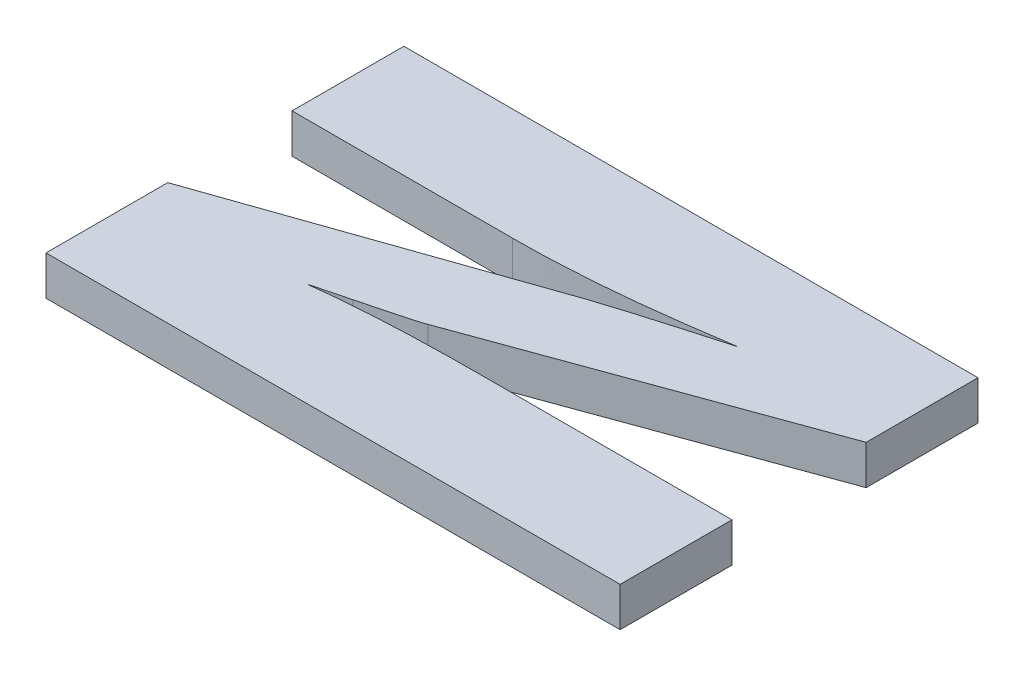
ISO-10303-21;
HEADER;
FILE_DESCRIPTION(('STEP AP214'),'2;1');
FILE_NAME('part.step','',(''),(''),'','','');
FILE_SCHEMA(('AUTOMOTIVE_DESIGN { 1 0 10303 214 1 1 1 1 }'));
ENDSEC;
DATA;
#1=APPLICATION_CONTEXT('core data for automotive mechanical design processes');
#2=APPLICATION_PROTOCOL_DEFINITION('international standard','automotive_design',2000,#1);
#3=PRODUCT_CONTEXT('',#1,'mechanical');
#4=PRODUCT('Part','Part','',(#3));
#5=PRODUCT_RELATED_PRODUCT_CATEGORY('part','',(#4));
#6=PRODUCT_DEFINITION_FORMATION('','',#4);
#7=PRODUCT_DEFINITION_CONTEXT('part definition',#1,'design');
#8=PRODUCT_DEFINITION('design','',#6,#7);
#9=PRODUCT_DEFINITION_SHAPE('','',#8);
#10=(LENGTH_UNIT() NAMED_UNIT(*) SI_UNIT(.MILLI.,.METRE.));
#11=(NAMED_UNIT(*) PLANE_ANGLE_UNIT() SI_UNIT($,.RADIAN.));
#12=(NAMED_UNIT(*) SI_UNIT($,.STERADIAN.) SOLID_ANGLE_UNIT());
#13=UNCERTAINTY_MEASURE_WITH_UNIT(LENGTH_MEASURE(1.E-05),#10,'distance_accuracy_value','');
#14=(GEOMETRIC_REPRESENTATION_CONTEXT(3) GLOBAL_UNCERTAINTY_ASSIGNED_CONTEXT((#13)) GLOBAL_UNIT_ASSIGNED_CONTEXT((#10,
#11,#12)) REPRESENTATION_CONTEXT('',''));
#15=CARTESIAN_POINT('',(0.,0.,0.));
#16=DIRECTION('',(0.,0.,1.));
#17=DIRECTION('',(1.,0.,0.));
#18=AXIS2_PLACEMENT_3D('',#15,#16,#17);
#19=CARTESIAN_POINT('',(2.55,2.9956,4.5909090909091));
#20=DIRECTION('',(1.,0.,0.));
#21=DIRECTION('',(0.,-1.,0.));
#22=AXIS2_PLACEMENT_3D('',#19,#20,#21);
#23=PLANE('',#22);
#24=DIRECTION('',(0.,0.,1.));
#25=VECTOR('',#24,1.);
#26=CARTESIAN_POINT('',(2.55,2.9306,4.5909090909091));
#27=LINE('',#26,#25);
#28=CARTESIAN_POINT('',(2.55,2.9306,4.5909090909091));
#29=VERTEX_POINT('',#28);
#30=CARTESIAN_POINT('',(2.55,2.9306,4.775974025974));
#31=VERTEX_POINT('',#30);
#32=EDGE_CURVE('E11',#29,#31,#27,.T.);
#33=ORIENTED_EDGE('',*,*,#32,.F.);
#34=DIRECTION('',(0.,-1.,0.));
#35=VECTOR('',#34,1.);
#36=CARTESIAN_POINT('',(2.55,2.9956,4.5909090909091));
#37=LINE('',#36,#35);
#38=CARTESIAN_POINT('',(2.55,2.9956,4.5909090909091));
#39=VERTEX_POINT('',#38);
#40=EDGE_CURVE('E24',#39,#29,#37,.T.);
#41=ORIENTED_EDGE('',*,*,#40,.F.);
#42=DIRECTION('',(0.,0.,1.));
#43=VECTOR('',#42,1.);
#44=CARTESIAN_POINT('',(2.55,2.9956,4.5909090909091));
#45=LINE('',#44,#43);
#46=CARTESIAN_POINT('',(2.55,2.9956,4.775974025974));
#47=VERTEX_POINT('',#46);
#48=EDGE_CURVE('E304',#39,#47,#45,.T.);
#49=ORIENTED_EDGE('',*,*,#48,.T.);
#50=DIRECTION('',(0.,-1.,0.));
#51=VECTOR('',#50,1.);
#52=CARTESIAN_POINT('',(2.55,2.9956,4.775974025974));
#53=LINE('',#52,#51);
#54=EDGE_CURVE('E144',#47,#31,#53,.T.);
#55=ORIENTED_EDGE('',*,*,#54,.T.);
#56=EDGE_LOOP('',(#33,#41,#49,#55));
#57=FACE_BOUND('',#56,.T.);
#58=ADVANCED_FACE('F17',(#57),#23,.T.);
#59=CARTESIAN_POINT('',(2.1505681818182,2.9956,4.5909090909091));
#60=DIRECTION('',(0.,0.,-1.));
#61=DIRECTION('',(0.,1.,0.));
#62=AXIS2_PLACEMENT_3D('',#59,#60,#61);
#63=PLANE('',#62);
#64=DIRECTION('',(1.,0.,0.));
#65=VECTOR('',#64,1.);
#66=CARTESIAN_POINT('',(2.1505681818182,2.9306,4.5909090909091));
#67=LINE('',#66,#65);
#68=CARTESIAN_POINT('',(2.1505681818182,2.9306,4.5909090909091));
#69=VERTEX_POINT('',#68);
#70=EDGE_CURVE('E301',#69,#29,#67,.T.);
#71=ORIENTED_EDGE('',*,*,#70,.F.);
#72=DIRECTION('',(0.,-1.,0.));
#73=VECTOR('',#72,1.);
#74=CARTESIAN_POINT('',(2.1505681818182,2.9956,4.5909090909091));
#75=LINE('',#74,#73);
#76=CARTESIAN_POINT('',(2.1505681818182,2.9956,4.5909090909091));
#77=VERTEX_POINT('',#76);
#78=EDGE_CURVE('E298',#77,#69,#75,.T.);
#79=ORIENTED_EDGE('',*,*,#78,.F.);
#80=DIRECTION('',(1.,0.,0.));
#81=VECTOR('',#80,1.);
#82=CARTESIAN_POINT('',(2.1505681818182,2.9956,4.5909090909091));
#83=LINE('',#82,#81);
#84=EDGE_CURVE('E292',#77,#39,#83,.T.);
#85=ORIENTED_EDGE('',*,*,#84,.T.);
#86=ORIENTED_EDGE('',*,*,#40,.T.);
#87=EDGE_LOOP('',(#71,#79,#85,#86));
#88=FACE_BOUND('',#87,.T.);
#89=ADVANCED_FACE('F306',(#88),#63,.T.);
#90=CARTESIAN_POINT('',(1.8602475649351,2.9956,4.604788961039));
#91=CARTESIAN_POINT('',(1.8602475649351,2.9306,4.604788961039));
#92=CARTESIAN_POINT('',(1.8697539808169,2.9956,4.6036621336621));
#93=CARTESIAN_POINT('',(1.8697539808169,2.9306,4.6036621336621));
#94=CARTESIAN_POINT('',(1.8893246513752,2.9956,4.6013423564039));
#95=CARTESIAN_POINT('',(1.8893246513752,2.9306,4.6013423564039));
#96=CARTESIAN_POINT('',(1.9195917324686,2.9956,4.5984390117173));
#97=CARTESIAN_POINT('',(1.9195917324686,2.9306,4.5984390117173));
#98=CARTESIAN_POINT('',(1.9516087312064,2.9956,4.596204791172));
#99=CARTESIAN_POINT('',(1.9516087312064,2.9306,4.596204791172));
#100=CARTESIAN_POINT('',(1.9856671068956,2.9956,4.5942387039112));
#101=CARTESIAN_POINT('',(1.9856671068956,2.9306,4.5942387039112));
#102=CARTESIAN_POINT('',(2.0222994249118,2.9956,4.5927276615182));
#103=CARTESIAN_POINT('',(2.0222994249118,2.9306,4.5927276615182));
#104=CARTESIAN_POINT('',(2.0620767162216,2.9956,4.5915279327125));
#105=CARTESIAN_POINT('',(2.0620767162216,2.9306,4.5915279327125));
#106=CARTESIAN_POINT('',(2.1052002503024,2.9956,4.5910264861099));
#107=CARTESIAN_POINT('',(2.1052002503024,2.9306,4.5910264861099));
#108=CARTESIAN_POINT('',(2.1350817933421,2.9956,4.5909491638775));
#109=CARTESIAN_POINT('',(2.1350817933421,2.9306,4.5909491638775));
#110=CARTESIAN_POINT('',(2.1505681818182,2.9956,4.5909090909091));
#111=CARTESIAN_POINT('',(2.1505681818182,2.9306,4.5909090909091));
#112=B_SPLINE_SURFACE_WITH_KNOTS('',3,1,((#90,#91),(#92,#93),(#94,#95),(#96,#97),(#98,#99),
(#100,#101),(#102,#103),(#104,#105),(#106,#107),(#108,#109),(#110,#111)),.UNSPECIFIED.,.F.,.F.,
.F.,(4,1,1,1,1,1,1,1,4),(2,2),(0.,0.0987436761301101,0.203281655177407,0.313598331697713,
0.429782574178868,0.555169367497819,0.691769978254937,0.840256915434746,1.),(0.,1.),.UNSPECIFIED.);
#113=CARTESIAN_POINT('',(1.8602475649351,2.9306,4.604788961039));
#114=CARTESIAN_POINT('',(1.8697539808169,2.9306,4.6036621336621));
#115=CARTESIAN_POINT('',(1.8893246513752,2.9306,4.6013423564039));
#116=CARTESIAN_POINT('',(1.9195917324686,2.9306,4.5984390117173));
#117=CARTESIAN_POINT('',(1.9516087312064,2.9306,4.596204791172));
#118=CARTESIAN_POINT('',(1.9856671068956,2.9306,4.5942387039112));
#119=CARTESIAN_POINT('',(2.0222994249118,2.9306,4.5927276615182));
#120=CARTESIAN_POINT('',(2.0620767162216,2.9306,4.5915279327125));
#121=CARTESIAN_POINT('',(2.1052002503024,2.9306,4.5910264861099));
#122=CARTESIAN_POINT('',(2.1350817933421,2.9306,4.5909491638775));
#123=CARTESIAN_POINT('',(2.1505681818182,2.9306,4.5909090909091));
#124=B_SPLINE_CURVE_WITH_KNOTS('',3,(#113,#114,#115,#116,#117,#118,#119,#120,#121,#122,#123),
.UNSPECIFIED.,.F.,.F.,(4,1,1,1,1,1,1,1,4),(0.,0.0987436761301101,0.203281655177407,
0.313598331697713,0.429782574178868,0.555169367497819,0.691769978254937,0.840256915434746,1.),.UNSPECIFIED.);
#125=CARTESIAN_POINT('',(1.8602475649351,2.9306,4.604788961039));
#126=VERTEX_POINT('',#125);
#127=EDGE_CURVE('E287',#126,#69,#124,.T.);
#128=DIRECTION('',(0.,-1.,0.));
#129=VECTOR('',#128,1.);
#130=CARTESIAN_POINT('',(1.8602475649351,2.9956,4.604788961039));
#131=LINE('',#130,#129);
#132=CARTESIAN_POINT('',(1.8602475649351,2.9956,4.604788961039));
#133=VERTEX_POINT('',#132);
#134=EDGE_CURVE('E281',#133,#126,#131,.T.);
#135=CARTESIAN_POINT('',(1.8602475649351,2.9956,4.604788961039));
#136=CARTESIAN_POINT('',(1.8697539808169,2.9956,4.6036621336621));
#137=CARTESIAN_POINT('',(1.8893246513752,2.9956,4.6013423564039));
#138=CARTESIAN_POINT('',(1.9195917324686,2.9956,4.5984390117173));
#139=CARTESIAN_POINT('',(1.9516087312064,2.9956,4.596204791172));
#140=CARTESIAN_POINT('',(1.9856671068956,2.9956,4.5942387039112));
#141=CARTESIAN_POINT('',(2.0222994249118,2.9956,4.5927276615182));
#142=CARTESIAN_POINT('',(2.0620767162216,2.9956,4.5915279327125));
#143=CARTESIAN_POINT('',(2.1052002503024,2.9956,4.5910264861099));
#144=CARTESIAN_POINT('',(2.1350817933421,2.9956,4.5909491638775));
#145=CARTESIAN_POINT('',(2.1505681818182,2.9956,4.5909090909091));
#146=B_SPLINE_CURVE_WITH_KNOTS('',3,(#135,#136,#137,#138,#139,#140,#141,#142,#143,#144,#145),
.UNSPECIFIED.,.F.,.F.,(4,1,1,1,1,1,1,1,4),(0.,0.0987436761301101,0.203281655177407,
0.313598331697713,0.429782574178868,0.555169367497819,0.691769978254937,0.840256915434746,1.),.UNSPECIFIED.);
#147=EDGE_CURVE('E273',#133,#77,#146,.T.);
#148=ORIENTED_EDGE('',*,*,#127,.F.);
#149=ORIENTED_EDGE('',*,*,#134,.F.);
#150=ORIENTED_EDGE('',*,*,#147,.T.);
#151=ORIENTED_EDGE('',*,*,#78,.T.);
#152=EDGE_LOOP('',(#148,#149,#150,#151));
#153=FACE_BOUND('',#152,.T.);
#154=ADVANCED_FACE('F310',(#153),#112,.T.);
#155=CARTESIAN_POINT('',(1.9213575487013,2.9956,4.5889813311688));
#156=CARTESIAN_POINT('',(1.9213575487013,2.9306,4.5889813311688));
#157=CARTESIAN_POINT('',(1.9151961299531,2.9956,4.5906166048887));
#158=CARTESIAN_POINT('',(1.9151961299531,2.9306,4.5906166048887));
#159=CARTESIAN_POINT('',(1.9036569084999,2.9956,4.5936791764101));
#160=CARTESIAN_POINT('',(1.9036569084999,2.9306,4.5936791764101));
#161=CARTESIAN_POINT('',(1.8872464681369,2.9956,4.5975771675348));
#162=CARTESIAN_POINT('',(1.8872464681369,2.9306,4.5975771675348));
#163=CARTESIAN_POINT('',(1.8731353541589,2.9956,4.6015852430675));
#164=CARTESIAN_POINT('',(1.8731353541589,2.9306,4.6015852430675));
#165=CARTESIAN_POINT('',(1.8643012099442,2.9956,4.6037812835281));
#166=CARTESIAN_POINT('',(1.8643012099442,2.9306,4.6037812835281));
#167=CARTESIAN_POINT('',(1.8602475649351,2.9956,4.604788961039));
#168=CARTESIAN_POINT('',(1.8602475649351,2.9306,4.604788961039));
#169=B_SPLINE_SURFACE_WITH_KNOTS('',3,1,((#155,#156),(#157,#158),(#159,#160),(#161,#162),(#163,
#164),(#165,#166),(#167,#168)),.UNSPECIFIED.,.F.,.F.,.F.,(4,1,1,1,4),(2,2),(0.,
0.302959861360813,0.567388952857916,0.801491625049401,1.),(0.,1.),.UNSPECIFIED.);
#170=CARTESIAN_POINT('',(1.9213575487013,2.9306,4.5889813311688));
#171=CARTESIAN_POINT('',(1.9151961299531,2.9306,4.5906166048887));
#172=CARTESIAN_POINT('',(1.9036569084999,2.9306,4.5936791764101));
#173=CARTESIAN_POINT('',(1.8872464681369,2.9306,4.5975771675348));
#174=CARTESIAN_POINT('',(1.8731353541589,2.9306,4.6015852430675));
#175=CARTESIAN_POINT('',(1.8643012099442,2.9306,4.6037812835281));
#176=CARTESIAN_POINT('',(1.8602475649351,2.9306,4.604788961039));
#177=B_SPLINE_CURVE_WITH_KNOTS('',3,(#170,#171,#172,#173,#174,#175,#176),.UNSPECIFIED.,.F.,.F.,
(4,1,1,1,4),(0.,0.302959861360813,0.567388952857916,0.801491625049401,1.),.UNSPECIFIED.);
#178=CARTESIAN_POINT('',(1.9213575487013,2.9306,4.5889813311688));
#179=VERTEX_POINT('',#178);
#180=EDGE_CURVE('E268',#179,#126,#177,.T.);
#181=DIRECTION('',(0.,-1.,0.));
#182=VECTOR('',#181,1.);
#183=CARTESIAN_POINT('',(1.9213575487013,2.9956,4.5889813311688));
#184=LINE('',#183,#182);
#185=CARTESIAN_POINT('',(1.9213575487013,2.9956,4.5889813311688));
#186=VERTEX_POINT('',#185);
#187=EDGE_CURVE('E262',#186,#179,#184,.T.);
#188=CARTESIAN_POINT('',(1.9213575487013,2.9956,4.5889813311688));
#189=CARTESIAN_POINT('',(1.9151961299531,2.9956,4.5906166048887));
#190=CARTESIAN_POINT('',(1.9036569084999,2.9956,4.5936791764101));
#191=CARTESIAN_POINT('',(1.8872464681369,2.9956,4.5975771675348));
#192=CARTESIAN_POINT('',(1.8731353541589,2.9956,4.6015852430675));
#193=CARTESIAN_POINT('',(1.8643012099442,2.9956,4.6037812835281));
#194=CARTESIAN_POINT('',(1.8602475649351,2.9956,4.604788961039));
#195=B_SPLINE_CURVE_WITH_KNOTS('',3,(#188,#189,#190,#191,#192,#193,#194),.UNSPECIFIED.,.F.,.F.,
(4,1,1,1,4),(0.,0.302959861360813,0.567388952857916,0.801491625049401,1.),.UNSPECIFIED.);
#196=EDGE_CURVE('E254',#186,#133,#195,.T.);
#197=ORIENTED_EDGE('',*,*,#180,.F.);
#198=ORIENTED_EDGE('',*,*,#187,.F.);
#199=ORIENTED_EDGE('',*,*,#196,.T.);
#200=ORIENTED_EDGE('',*,*,#134,.T.);
#201=EDGE_LOOP('',(#197,#198,#199,#200));
#202=FACE_BOUND('',#201,.T.);
#203=ADVANCED_FACE('F313',(#202),#169,.T.);
#204=CARTESIAN_POINT('',(2.0183238636364,2.9956,4.5623782467532));
#205=CARTESIAN_POINT('',(2.0183238636364,2.9306,4.5623782467532));
#206=CARTESIAN_POINT('',(2.0169816937916,2.9956,4.5629137536397));
#207=CARTESIAN_POINT('',(2.0169816937916,2.9306,4.5629137536397));
#208=CARTESIAN_POINT('',(2.0135800670099,2.9956,4.5642709548717));
#209=CARTESIAN_POINT('',(2.0135800670099,2.9306,4.5642709548717));
#210=CARTESIAN_POINT('',(2.0071079836794,2.9956,4.5659962645994));
#211=CARTESIAN_POINT('',(2.0071079836794,2.9306,4.5659962645994));
#212=CARTESIAN_POINT('',(1.9985576379269,2.9956,4.568920053333));
#213=CARTESIAN_POINT('',(1.9985576379269,2.9306,4.568920053333));
#214=CARTESIAN_POINT('',(1.9874351628143,2.9956,4.5715359700669));
#215=CARTESIAN_POINT('',(1.9874351628143,2.9306,4.5715359700669));
#216=CARTESIAN_POINT('',(1.9742252344209,2.9956,4.5754038814864));
#217=CARTESIAN_POINT('',(1.9742252344209,2.9306,4.5754038814864));
#218=CARTESIAN_POINT('',(1.9586132305068,2.9956,4.5792890838041));
#219=CARTESIAN_POINT('',(1.9586132305068,2.9306,4.5792890838041));
#220=CARTESIAN_POINT('',(1.9407775029187,2.9956,4.5840220117456));
#221=CARTESIAN_POINT('',(1.9407775029187,2.9306,4.5840220117456));
#222=CARTESIAN_POINT('',(1.9281076586355,2.9956,4.5872575397051));
#223=CARTESIAN_POINT('',(1.9281076586355,2.9306,4.5872575397051));
#224=CARTESIAN_POINT('',(1.9213575487013,2.9956,4.5889813311688));
#225=CARTESIAN_POINT('',(1.9213575487013,2.9306,4.5889813311688));
#226=B_SPLINE_SURFACE_WITH_KNOTS('',3,1,((#204,#205),(#206,#207),(#208,#209),(#210,#211),(#212,
#213),(#214,#215),(#216,#217),(#218,#219),(#220,#221),(#222,#223),(#224,#225)),.UNSPECIFIED.,
.F.,.F.,.F.,(4,1,1,1,1,1,1,1,4),(2,2),(0.,0.0430697473976179,0.109156979497173,
0.199480512125101,0.312444897220287,0.449610880992788,0.609986257442444,0.792212470866252,1.),
(0.,1.),.UNSPECIFIED.);
#227=CARTESIAN_POINT('',(2.0183238636364,2.9306,4.5623782467532));
#228=CARTESIAN_POINT('',(2.0169816937916,2.9306,4.5629137536397));
#229=CARTESIAN_POINT('',(2.0135800670099,2.9306,4.5642709548717));
#230=CARTESIAN_POINT('',(2.0071079836794,2.9306,4.5659962645994));
#231=CARTESIAN_POINT('',(1.9985576379269,2.9306,4.568920053333));
#232=CARTESIAN_POINT('',(1.9874351628143,2.9306,4.5715359700669));
#233=CARTESIAN_POINT('',(1.9742252344209,2.9306,4.5754038814864));
#234=CARTESIAN_POINT('',(1.9586132305068,2.9306,4.5792890838041));
#235=CARTESIAN_POINT('',(1.9407775029187,2.9306,4.5840220117456));
#236=CARTESIAN_POINT('',(1.9281076586355,2.9306,4.5872575397051));
#237=CARTESIAN_POINT('',(1.9213575487013,2.9306,4.5889813311688));
#238=B_SPLINE_CURVE_WITH_KNOTS('',3,(#227,#228,#229,#230,#231,#232,#233,#234,#235,#236,#237),
.UNSPECIFIED.,.F.,.F.,(4,1,1,1,1,1,1,1,4),(0.,0.0430697473976179,0.109156979497173,
0.199480512125101,0.312444897220287,0.449610880992788,0.609986257442444,0.792212470866252,1.),.UNSPECIFIED.);
#239=CARTESIAN_POINT('',(2.0183238636364,2.9306,4.5623782467532));
#240=VERTEX_POINT('',#239);
#241=EDGE_CURVE('E249',#240,#179,#238,.T.);
#242=DIRECTION('',(0.,-1.,0.));
#243=VECTOR('',#242,1.);
#244=CARTESIAN_POINT('',(2.0183238636364,2.9956,4.5623782467532));
#245=LINE('',#244,#243);
#246=CARTESIAN_POINT('',(2.0183238636364,2.9956,4.5623782467532));
#247=VERTEX_POINT('',#246);
#248=EDGE_CURVE('E243',#247,#240,#245,.T.);
#249=CARTESIAN_POINT('',(2.0183238636364,2.9956,4.5623782467532));
#250=CARTESIAN_POINT('',(2.0169816937916,2.9956,4.5629137536397));
#251=CARTESIAN_POINT('',(2.0135800670099,2.9956,4.5642709548717));
#252=CARTESIAN_POINT('',(2.0071079836794,2.9956,4.5659962645994));
#253=CARTESIAN_POINT('',(1.9985576379269,2.9956,4.568920053333));
#254=CARTESIAN_POINT('',(1.9874351628143,2.9956,4.5715359700669));
#255=CARTESIAN_POINT('',(1.9742252344209,2.9956,4.5754038814864));
#256=CARTESIAN_POINT('',(1.9586132305068,2.9956,4.5792890838041));
#257=CARTESIAN_POINT('',(1.9407775029187,2.9956,4.5840220117456));
#258=CARTESIAN_POINT('',(1.9281076586355,2.9956,4.5872575397051));
#259=CARTESIAN_POINT('',(1.9213575487013,2.9956,4.5889813311688));
#260=B_SPLINE_CURVE_WITH_KNOTS('',3,(#249,#250,#251,#252,#253,#254,#255,#256,#257,#258,#259),
.UNSPECIFIED.,.F.,.F.,(4,1,1,1,1,1,1,1,4),(0.,0.0430697473976179,0.109156979497173,
0.199480512125101,0.312444897220287,0.449610880992788,0.609986257442444,0.792212470866252,1.),.UNSPECIFIED.);
#261=EDGE_CURVE('E238',#247,#186,#260,.T.);
#262=ORIENTED_EDGE('',*,*,#241,.F.);
#263=ORIENTED_EDGE('',*,*,#248,.F.);
#264=ORIENTED_EDGE('',*,*,#261,.T.);
#265=ORIENTED_EDGE('',*,*,#187,.T.);
#266=EDGE_LOOP('',(#262,#263,#264,#265));
#267=FACE_BOUND('',#266,.T.);
#268=ADVANCED_FACE('F318',(#267),#226,.T.);
#269=CARTESIAN_POINT('',(2.55,2.9956,4.3688311688312));
#270=DIRECTION('',(0.342071316104112,0.,0.939673993839779));
#271=DIRECTION('',(0.939673993839779,0.,-0.342071316104112));
#272=AXIS2_PLACEMENT_3D('',#269,#270,#271);
#273=PLANE('',#272);
#274=DIRECTION('',(-0.939673993839779,0.,0.342071316104112));
#275=VECTOR('',#274,1.);
#276=CARTESIAN_POINT('',(2.55,2.9306,4.3688311688312));
#277=LINE('',#276,#275);
#278=CARTESIAN_POINT('',(2.55,2.9306,4.3688311688312));
#279=VERTEX_POINT('',#278);
#280=EDGE_CURVE('E235',#279,#240,#277,.T.);
#281=ORIENTED_EDGE('',*,*,#280,.F.);
#282=DIRECTION('',(0.,-1.,0.));
#283=VECTOR('',#282,1.);
#284=CARTESIAN_POINT('',(2.55,2.9956,4.3688311688312));
#285=LINE('',#284,#283);
#286=CARTESIAN_POINT('',(2.55,2.9956,4.3688311688312));
#287=VERTEX_POINT('',#286);
#288=EDGE_CURVE('E232',#287,#279,#285,.T.);
#289=ORIENTED_EDGE('',*,*,#288,.F.);
#290=DIRECTION('',(-0.939673993839779,0.,0.342071316104112));
#291=VECTOR('',#290,1.);
#292=CARTESIAN_POINT('',(2.55,2.9956,4.3688311688312));
#293=LINE('',#292,#291);
#294=EDGE_CURVE('E229',#287,#247,#293,.T.);
#295=ORIENTED_EDGE('',*,*,#294,.T.);
#296=ORIENTED_EDGE('',*,*,#248,.T.);
#297=EDGE_LOOP('',(#281,#289,#295,#296));
#298=FACE_BOUND('',#297,.T.);
#299=ADVANCED_FACE('F320',(#298),#273,.T.);
#300=CARTESIAN_POINT('',(2.55,2.9956,4.1837662337662));
#301=DIRECTION('',(1.,0.,0.));
#302=DIRECTION('',(0.,-1.,0.));
#303=AXIS2_PLACEMENT_3D('',#300,#301,#302);
#304=PLANE('',#303);
#305=DIRECTION('',(0.,0.,1.));
#306=VECTOR('',#305,1.);
#307=CARTESIAN_POINT('',(2.55,2.9306,4.1837662337662));
#308=LINE('',#307,#306);
#309=CARTESIAN_POINT('',(2.55,2.9306,4.1837662337662));
#310=VERTEX_POINT('',#309);
#311=EDGE_CURVE('E226',#310,#279,#308,.T.);
#312=ORIENTED_EDGE('',*,*,#311,.F.);
#313=DIRECTION('',(0.,-1.,0.));
#314=VECTOR('',#313,1.);
#315=CARTESIAN_POINT('',(2.55,2.9956,4.1837662337662));
#316=LINE('',#315,#314);
#317=CARTESIAN_POINT('',(2.55,2.9956,4.1837662337662));
#318=VERTEX_POINT('',#317);
#319=EDGE_CURVE('E223',#318,#310,#316,.T.);
#320=ORIENTED_EDGE('',*,*,#319,.F.);
#321=DIRECTION('',(0.,0.,1.));
#322=VECTOR('',#321,1.);
#323=CARTESIAN_POINT('',(2.55,2.9956,4.1837662337662));
#324=LINE('',#323,#322);
#325=EDGE_CURVE('E220',#318,#287,#324,.T.);
#326=ORIENTED_EDGE('',*,*,#325,.T.);
#327=ORIENTED_EDGE('',*,*,#288,.T.);
#328=EDGE_LOOP('',(#312,#320,#326,#327));
#329=FACE_BOUND('',#328,.T.);
#330=ADVANCED_FACE('F322',(#329),#304,.T.);
#331=CARTESIAN_POINT('',(1.6,2.9956,4.1837662337662));
#332=DIRECTION('',(0.,0.,-1.));
#333=DIRECTION('',(0.,1.,0.));
#334=AXIS2_PLACEMENT_3D('',#331,#332,#333);
#335=PLANE('',#334);
#336=DIRECTION('',(1.,0.,0.));
#337=VECTOR('',#336,1.);
#338=CARTESIAN_POINT('',(1.6,2.9306,4.1837662337662));
#339=LINE('',#338,#337);
#340=CARTESIAN_POINT('',(1.6,2.9306,4.1837662337662));
#341=VERTEX_POINT('',#340);
#342=EDGE_CURVE('E217',#341,#310,#339,.T.);
#343=ORIENTED_EDGE('',*,*,#342,.F.);
#344=DIRECTION('',(0.,-1.,0.));
#345=VECTOR('',#344,1.);
#346=CARTESIAN_POINT('',(1.6,2.9956,4.1837662337662));
#347=LINE('',#346,#345);
#348=CARTESIAN_POINT('',(1.6,2.9956,4.1837662337662));
#349=VERTEX_POINT('',#348);
#350=EDGE_CURVE('E214',#349,#341,#347,.T.);
#351=ORIENTED_EDGE('',*,*,#350,.F.);
#352=DIRECTION('',(1.,0.,0.));
#353=VECTOR('',#352,1.);
#354=CARTESIAN_POINT('',(1.6,2.9956,4.1837662337662));
#355=LINE('',#354,#353);
#356=EDGE_CURVE('E211',#349,#318,#355,.T.);
#357=ORIENTED_EDGE('',*,*,#356,.T.);
#358=ORIENTED_EDGE('',*,*,#319,.T.);
#359=EDGE_LOOP('',(#343,#351,#357,#358));
#360=FACE_BOUND('',#359,.T.);
#361=ADVANCED_FACE('F325',(#360),#335,.T.);
#362=CARTESIAN_POINT('',(1.6,2.9956,4.3688311688312));
#363=DIRECTION('',(-1.,0.,0.));
#364=DIRECTION('',(0.,1.,0.));
#365=AXIS2_PLACEMENT_3D('',#362,#363,#364);
#366=PLANE('',#365);
#367=DIRECTION('',(0.,0.,-1.));
#368=VECTOR('',#367,1.);
#369=CARTESIAN_POINT('',(1.6,2.9306,4.3688311688312));
#370=LINE('',#369,#368);
#371=CARTESIAN_POINT('',(1.6,2.9306,4.3688311688312));
#372=VERTEX_POINT('',#371);
#373=EDGE_CURVE('E208',#372,#341,#370,.T.);
#374=ORIENTED_EDGE('',*,*,#373,.F.);
#375=DIRECTION('',(0.,-1.,0.));
#376=VECTOR('',#375,1.);
#377=CARTESIAN_POINT('',(1.6,2.9956,4.3688311688312));
#378=LINE('',#377,#376);
#379=CARTESIAN_POINT('',(1.6,2.9956,4.3688311688312));
#380=VERTEX_POINT('',#379);
#381=EDGE_CURVE('E205',#380,#372,#378,.T.);
#382=ORIENTED_EDGE('',*,*,#381,.F.);
#383=DIRECTION('',(0.,0.,-1.));
#384=VECTOR('',#383,1.);
#385=CARTESIAN_POINT('',(1.6,2.9956,4.3688311688312));
#386=LINE('',#385,#384);
#387=EDGE_CURVE('E202',#380,#349,#386,.T.);
#388=ORIENTED_EDGE('',*,*,#387,.T.);
#389=ORIENTED_EDGE('',*,*,#350,.T.);
#390=EDGE_LOOP('',(#374,#382,#388,#389));
#391=FACE_BOUND('',#390,.T.);
#392=ADVANCED_FACE('F330',(#391),#366,.T.);
#393=CARTESIAN_POINT('',(1.9651176948052,2.9956,4.3688311688312));
#394=DIRECTION('',(0.,0.,1.));
#395=DIRECTION('',(0.,-1.,0.));
#396=AXIS2_PLACEMENT_3D('',#393,#394,#395);
#397=PLANE('',#396);
#398=DIRECTION('',(-1.,0.,0.));
#399=VECTOR('',#398,1.);
#400=CARTESIAN_POINT('',(1.9651176948052,2.9306,4.3688311688312));
#401=LINE('',#400,#399);
#402=CARTESIAN_POINT('',(1.9651176948052,2.9306,4.3688311688312));
#403=VERTEX_POINT('',#402);
#404=EDGE_CURVE('E199',#403,#372,#401,.T.);
#405=ORIENTED_EDGE('',*,*,#404,.F.);
#406=DIRECTION('',(0.,-1.,0.));
#407=VECTOR('',#406,1.);
#408=CARTESIAN_POINT('',(1.9651176948052,2.9956,4.3688311688312));
#409=LINE('',#408,#407);
#410=CARTESIAN_POINT('',(1.9651176948052,2.9956,4.3688311688312));
#411=VERTEX_POINT('',#410);
#412=EDGE_CURVE('E196',#411,#403,#409,.T.);
#413=ORIENTED_EDGE('',*,*,#412,.F.);
#414=DIRECTION('',(-1.,0.,0.));
#415=VECTOR('',#414,1.);
#416=CARTESIAN_POINT('',(1.9651176948052,2.9956,4.3688311688312));
#417=LINE('',#416,#415);
#418=EDGE_CURVE('E190',#411,#380,#417,.T.);
#419=ORIENTED_EDGE('',*,*,#418,.T.);
#420=ORIENTED_EDGE('',*,*,#381,.T.);
#421=EDGE_LOOP('',(#405,#413,#419,#420));
#422=FACE_BOUND('',#421,.T.);
#423=ADVANCED_FACE('F332',(#422),#397,.T.);
#424=CARTESIAN_POINT('',(2.3072950487013,2.9956,4.337987012987));
#425=CARTESIAN_POINT('',(2.3072950487013,2.9306,4.337987012987));
#426=CARTESIAN_POINT('',(2.2908516760677,2.9956,4.340476441245));
#427=CARTESIAN_POINT('',(2.2908516760677,2.9306,4.340476441245));
#428=CARTESIAN_POINT('',(2.2587014684146,2.9956,4.3453437903719));
#429=CARTESIAN_POINT('',(2.2587014684146,2.9306,4.3453437903719));
#430=CARTESIAN_POINT('',(2.2113995471463,2.9956,4.3516863739711));
#431=CARTESIAN_POINT('',(2.2113995471463,2.9306,4.3516863739711));
#432=CARTESIAN_POINT('',(2.166171048025,2.9956,4.3571663158553));
#433=CARTESIAN_POINT('',(2.166171048025,2.9306,4.3571663158553));
#434=CARTESIAN_POINT('',(2.122842676432,2.9956,4.3613747490034));
#435=CARTESIAN_POINT('',(2.122842676432,2.9306,4.3613747490034));
#436=CARTESIAN_POINT('',(2.0813279015421,2.9956,4.3647228473113));
#437=CARTESIAN_POINT('',(2.0813279015421,2.9306,4.3647228473113));
#438=CARTESIAN_POINT('',(2.0413443974301,2.9956,4.3669461656495));
#439=CARTESIAN_POINT('',(2.0413443974301,2.9306,4.3669461656495));
#440=CARTESIAN_POINT('',(2.0027887227412,2.9956,4.368699306669));
#441=CARTESIAN_POINT('',(2.0027887227412,2.9306,4.368699306669));
#442=CARTESIAN_POINT('',(1.9775215478145,2.9956,4.3687877508793));
#443=CARTESIAN_POINT('',(1.9775215478145,2.9306,4.3687877508793));
#444=CARTESIAN_POINT('',(1.9651176948052,2.9956,4.3688311688312));
#445=CARTESIAN_POINT('',(1.9651176948052,2.9306,4.3688311688312));
#446=B_SPLINE_SURFACE_WITH_KNOTS('',3,1,((#424,#425),(#426,#427),(#428,#429),(#430,#431),(#432,
#433),(#434,#435),(#436,#437),(#438,#439),(#440,#441),(#442,#443),(#444,#445)),.UNSPECIFIED.,
.F.,.F.,.F.,(4,1,1,1,1,1,1,1,4),(2,2),(0.,0.14507440747839,0.28365058857009,0.416312772715358,
0.542481239820871,0.663376723781857,0.779606421742128,0.891807075510109,1.),(0.,1.),.UNSPECIFIED.);
#447=CARTESIAN_POINT('',(2.3072950487013,2.9306,4.337987012987));
#448=CARTESIAN_POINT('',(2.2908516760677,2.9306,4.340476441245));
#449=CARTESIAN_POINT('',(2.2587014684146,2.9306,4.3453437903719));
#450=CARTESIAN_POINT('',(2.2113995471463,2.9306,4.3516863739711));
#451=CARTESIAN_POINT('',(2.166171048025,2.9306,4.3571663158553));
#452=CARTESIAN_POINT('',(2.122842676432,2.9306,4.3613747490034));
#453=CARTESIAN_POINT('',(2.0813279015421,2.9306,4.3647228473113));
#454=CARTESIAN_POINT('',(2.0413443974301,2.9306,4.3669461656495));
#455=CARTESIAN_POINT('',(2.0027887227412,2.9306,4.368699306669));
#456=CARTESIAN_POINT('',(1.9775215478145,2.9306,4.3687877508793));
#457=CARTESIAN_POINT('',(1.9651176948052,2.9306,4.3688311688312));
#458=B_SPLINE_CURVE_WITH_KNOTS('',3,(#447,#448,#449,#450,#451,#452,#453,#454,#455,#456,#457),
.UNSPECIFIED.,.F.,.F.,(4,1,1,1,1,1,1,1,4),(0.,0.14507440747839,0.28365058857009,
0.416312772715358,0.542481239820871,0.663376723781857,0.779606421742128,0.891807075510109,1.),.UNSPECIFIED.);
#459=CARTESIAN_POINT('',(2.3072950487013,2.9306,4.337987012987));
#460=VERTEX_POINT('',#459);
#461=EDGE_CURVE('E185',#460,#403,#458,.T.);
#462=DIRECTION('',(0.,-1.,0.));
#463=VECTOR('',#462,1.);
#464=CARTESIAN_POINT('',(2.3072950487013,2.9956,4.337987012987));
#465=LINE('',#464,#463);
#466=CARTESIAN_POINT('',(2.3072950487013,2.9956,4.337987012987));
#467=VERTEX_POINT('',#466);
#468=EDGE_CURVE('E179',#467,#460,#465,.T.);
#469=CARTESIAN_POINT('',(2.3072950487013,2.9956,4.337987012987));
#470=CARTESIAN_POINT('',(2.2908516760677,2.9956,4.340476441245));
#471=CARTESIAN_POINT('',(2.2587014684146,2.9956,4.3453437903719));
#472=CARTESIAN_POINT('',(2.2113995471463,2.9956,4.3516863739711));
#473=CARTESIAN_POINT('',(2.166171048025,2.9956,4.3571663158553));
#474=CARTESIAN_POINT('',(2.122842676432,2.9956,4.3613747490034));
#475=CARTESIAN_POINT('',(2.0813279015421,2.9956,4.3647228473113));
#476=CARTESIAN_POINT('',(2.0413443974301,2.9956,4.3669461656495));
#477=CARTESIAN_POINT('',(2.0027887227412,2.9956,4.368699306669));
#478=CARTESIAN_POINT('',(1.9775215478145,2.9956,4.3687877508793));
#479=CARTESIAN_POINT('',(1.9651176948052,2.9956,4.3688311688312));
#480=B_SPLINE_CURVE_WITH_KNOTS('',3,(#469,#470,#471,#472,#473,#474,#475,#476,#477,#478,#479),
.UNSPECIFIED.,.F.,.F.,(4,1,1,1,1,1,1,1,4),(0.,0.14507440747839,0.28365058857009,
0.416312772715358,0.542481239820871,0.663376723781857,0.779606421742128,0.891807075510109,1.),.UNSPECIFIED.);
#481=EDGE_CURVE('E171',#467,#411,#480,.T.);
#482=ORIENTED_EDGE('',*,*,#461,.F.);
#483=ORIENTED_EDGE('',*,*,#468,.F.);
#484=ORIENTED_EDGE('',*,*,#481,.T.);
#485=ORIENTED_EDGE('',*,*,#412,.T.);
#486=EDGE_LOOP('',(#482,#483,#484,#485));
#487=FACE_BOUND('',#486,.T.);
#488=ADVANCED_FACE('F334',(#487),#446,.T.);
#489=CARTESIAN_POINT('',(2.1114346590909,2.9956,4.3960125811688));
#490=CARTESIAN_POINT('',(2.1114346590909,2.9306,4.3960125811688));
#491=CARTESIAN_POINT('',(2.1161211359251,2.9956,4.3944566899582));
#492=CARTESIAN_POINT('',(2.1161211359251,2.9306,4.3944566899582));
#493=CARTESIAN_POINT('',(2.1264977260241,2.9956,4.3910117043319));
#494=CARTESIAN_POINT('',(2.1264977260241,2.9306,4.3910117043319));
#495=CARTESIAN_POINT('',(2.1438106421468,2.9956,4.3856332433096));
#496=CARTESIAN_POINT('',(2.1438106421468,2.9306,4.3856332433096));
#497=CARTESIAN_POINT('',(2.1643459535287,2.9956,4.3792448943848));
#498=CARTESIAN_POINT('',(2.1643459535287,2.9306,4.3792448943848));
#499=CARTESIAN_POINT('',(2.1881001570757,2.9956,4.3722532879187));
#500=CARTESIAN_POINT('',(2.1881001570757,2.9306,4.3722532879187));
#501=CARTESIAN_POINT('',(2.2145217042341,2.9956,4.3642970690722));
#502=CARTESIAN_POINT('',(2.2145217042341,2.9306,4.3642970690722));
#503=CARTESIAN_POINT('',(2.2434805334995,2.9956,4.3560874626598));
#504=CARTESIAN_POINT('',(2.2434805334995,2.9306,4.3560874626598));
#505=CARTESIAN_POINT('',(2.2746477665062,2.9956,4.3472267459844));
#506=CARTESIAN_POINT('',(2.2746477665062,2.9306,4.3472267459844));
#507=CARTESIAN_POINT('',(2.2961776423401,2.9956,4.3411334270066));
#508=CARTESIAN_POINT('',(2.2961776423401,2.9306,4.3411334270066));
#509=CARTESIAN_POINT('',(2.3072950487013,2.9956,4.337987012987));
#510=CARTESIAN_POINT('',(2.3072950487013,2.9306,4.337987012987));
#511=B_SPLINE_SURFACE_WITH_KNOTS('',3,1,((#489,#490),(#491,#492),(#493,#494),(#495,#496),(#497,
#498),(#499,#500),(#501,#502),(#503,#504),(#505,#506),(#507,#508),(#509,#510)),.UNSPECIFIED.,
.F.,.F.,.F.,(4,1,1,1,1,1,1,1,4),(2,2),(0.,0.0725125711328384,0.160554133583103,0.26621580742301,
0.388324316739929,0.52417149537921,0.671417635251997,0.830329552281961,1.),(0.,1.),.UNSPECIFIED.);
#512=CARTESIAN_POINT('',(2.1114346590909,2.9306,4.3960125811688));
#513=CARTESIAN_POINT('',(2.1161211359251,2.9306,4.3944566899582));
#514=CARTESIAN_POINT('',(2.1264977260241,2.9306,4.3910117043319));
#515=CARTESIAN_POINT('',(2.1438106421468,2.9306,4.3856332433096));
#516=CARTESIAN_POINT('',(2.1643459535287,2.9306,4.3792448943848));
#517=CARTESIAN_POINT('',(2.1881001570757,2.9306,4.3722532879187));
#518=CARTESIAN_POINT('',(2.2145217042341,2.9306,4.3642970690722));
#519=CARTESIAN_POINT('',(2.2434805334995,2.9306,4.3560874626598));
#520=CARTESIAN_POINT('',(2.2746477665062,2.9306,4.3472267459844));
#521=CARTESIAN_POINT('',(2.2961776423401,2.9306,4.3411334270066));
#522=CARTESIAN_POINT('',(2.3072950487013,2.9306,4.337987012987));
#523=B_SPLINE_CURVE_WITH_KNOTS('',3,(#512,#513,#514,#515,#516,#517,#518,#519,#520,#521,#522),
.UNSPECIFIED.,.F.,.F.,(4,1,1,1,1,1,1,1,4),(0.,0.0725125711328384,0.160554133583103,
0.26621580742301,0.388324316739929,0.52417149537921,0.671417635251997,0.830329552281961,1.),.UNSPECIFIED.);
#524=CARTESIAN_POINT('',(2.1114346590909,2.9306,4.3960125811688));
#525=VERTEX_POINT('',#524);
#526=EDGE_CURVE('E166',#525,#460,#523,.T.);
#527=DIRECTION('',(0.,-1.,0.));
#528=VECTOR('',#527,1.);
#529=CARTESIAN_POINT('',(2.1114346590909,2.9956,4.3960125811688));
#530=LINE('',#529,#528);
#531=CARTESIAN_POINT('',(2.1114346590909,2.9956,4.3960125811688));
#532=VERTEX_POINT('',#531);
#533=EDGE_CURVE('E160',#532,#525,#530,.T.);
#534=CARTESIAN_POINT('',(2.1114346590909,2.9956,4.3960125811688));
#535=CARTESIAN_POINT('',(2.1161211359251,2.9956,4.3944566899582));
#536=CARTESIAN_POINT('',(2.1264977260241,2.9956,4.3910117043319));
#537=CARTESIAN_POINT('',(2.1438106421468,2.9956,4.3856332433096));
#538=CARTESIAN_POINT('',(2.1643459535287,2.9956,4.3792448943848));
#539=CARTESIAN_POINT('',(2.1881001570757,2.9956,4.3722532879187));
#540=CARTESIAN_POINT('',(2.2145217042341,2.9956,4.3642970690722));
#541=CARTESIAN_POINT('',(2.2434805334995,2.9956,4.3560874626598));
#542=CARTESIAN_POINT('',(2.2746477665062,2.9956,4.3472267459844));
#543=CARTESIAN_POINT('',(2.2961776423401,2.9956,4.3411334270066));
#544=CARTESIAN_POINT('',(2.3072950487013,2.9956,4.337987012987));
#545=B_SPLINE_CURVE_WITH_KNOTS('',3,(#534,#535,#536,#537,#538,#539,#540,#541,#542,#543,#544),
.UNSPECIFIED.,.F.,.F.,(4,1,1,1,1,1,1,1,4),(0.,0.0725125711328384,0.160554133583103,
0.26621580742301,0.388324316739929,0.52417149537921,0.671417635251997,0.830329552281961,1.),.UNSPECIFIED.);
#546=EDGE_CURVE('E155',#532,#467,#545,.T.);
#547=ORIENTED_EDGE('',*,*,#526,.F.);
#548=ORIENTED_EDGE('',*,*,#533,.F.);
#549=ORIENTED_EDGE('',*,*,#546,.T.);
#550=ORIENTED_EDGE('',*,*,#468,.T.);
#551=EDGE_LOOP('',(#547,#548,#549,#550));
#552=FACE_BOUND('',#551,.T.);
#553=ADVANCED_FACE('F337',(#552),#511,.T.);
#554=CARTESIAN_POINT('',(1.6,2.9956,4.5745231331169));
#555=DIRECTION('',(-0.329541853065483,0.,-0.944140967799919));
#556=DIRECTION('',(-0.944140967799919,0.,0.329541853065483));
#557=AXIS2_PLACEMENT_3D('',#554,#555,#556);
#558=PLANE('',#557);
#559=DIRECTION('',(0.944140967799919,0.,-0.329541853065483));
#560=VECTOR('',#559,1.);
#561=CARTESIAN_POINT('',(1.6,2.9306,4.5745231331169));
#562=LINE('',#561,#560);
#563=CARTESIAN_POINT('',(1.6,2.9306,4.5745231331169));
#564=VERTEX_POINT('',#563);
#565=EDGE_CURVE('E152',#564,#525,#562,.T.);
#566=ORIENTED_EDGE('',*,*,#565,.F.);
#567=DIRECTION('',(0.,-1.,0.));
#568=VECTOR('',#567,1.);
#569=CARTESIAN_POINT('',(1.6,2.9956,4.5745231331169));
#570=LINE('',#569,#568);
#571=CARTESIAN_POINT('',(1.6,2.9956,4.5745231331169));
#572=VERTEX_POINT('',#571);
#573=EDGE_CURVE('E150',#572,#564,#570,.T.);
#574=ORIENTED_EDGE('',*,*,#573,.F.);
#575=DIRECTION('',(0.944140967799919,0.,-0.329541853065483));
#576=VECTOR('',#575,1.);
#577=CARTESIAN_POINT('',(1.6,2.9956,4.5745231331169));
#578=LINE('',#577,#576);
#579=EDGE_CURVE('E139',#572,#532,#578,.T.);
#580=ORIENTED_EDGE('',*,*,#579,.T.);
#581=ORIENTED_EDGE('',*,*,#533,.T.);
#582=EDGE_LOOP('',(#566,#574,#580,#581));
#583=FACE_BOUND('',#582,.T.);
#584=ADVANCED_FACE('F339',(#583),#558,.T.);
#585=CARTESIAN_POINT('',(1.6,2.9956,4.775974025974));
#586=DIRECTION('',(-1.,0.,0.));
#587=DIRECTION('',(0.,1.,0.));
#588=AXIS2_PLACEMENT_3D('',#585,#586,#587);
#589=PLANE('',#588);
#590=DIRECTION('',(0.,0.,-1.));
#591=VECTOR('',#590,1.);
#592=CARTESIAN_POINT('',(1.6,2.9306,4.775974025974));
#593=LINE('',#592,#591);
#594=CARTESIAN_POINT('',(1.6,2.9306,4.775974025974));
#595=VERTEX_POINT('',#594);
#596=EDGE_CURVE('E126',#595,#564,#593,.T.);
#597=ORIENTED_EDGE('',*,*,#596,.F.);
#598=DIRECTION('',(0.,-1.,0.));
#599=VECTOR('',#598,1.);
#600=CARTESIAN_POINT('',(1.6,2.9956,4.775974025974));
#601=LINE('',#600,#599);
#602=CARTESIAN_POINT('',(1.6,2.9956,4.775974025974));
#603=VERTEX_POINT('',#602);
#604=EDGE_CURVE('E120',#603,#595,#601,.T.);
#605=ORIENTED_EDGE('',*,*,#604,.F.);
#606=DIRECTION('',(0.,0.,-1.));
#607=VECTOR('',#606,1.);
#608=CARTESIAN_POINT('',(1.6,2.9956,4.775974025974));
#609=LINE('',#608,#607);
#610=EDGE_CURVE('E124',#603,#572,#609,.T.);
#611=ORIENTED_EDGE('',*,*,#610,.T.);
#612=ORIENTED_EDGE('',*,*,#573,.T.);
#613=EDGE_LOOP('',(#597,#605,#611,#612));
#614=FACE_BOUND('',#613,.T.);
#615=ADVANCED_FACE('F122',(#614),#589,.T.);
#616=CARTESIAN_POINT('',(2.55,2.9956,4.775974025974));
#617=DIRECTION('',(0.,0.,1.));
#618=DIRECTION('',(0.,-1.,0.));
#619=AXIS2_PLACEMENT_3D('',#616,#617,#618);
#620=PLANE('',#619);
#621=DIRECTION('',(-1.,0.,0.));
#622=VECTOR('',#621,1.);
#623=CARTESIAN_POINT('',(2.55,2.9306,4.775974025974));
#624=LINE('',#623,#622);
#625=EDGE_CURVE('E140',#31,#595,#624,.T.);
#626=ORIENTED_EDGE('',*,*,#625,.F.);
#627=ORIENTED_EDGE('',*,*,#54,.F.);
#628=DIRECTION('',(-1.,0.,0.));
#629=VECTOR('',#628,1.);
#630=CARTESIAN_POINT('',(2.55,2.9956,4.775974025974));
#631=LINE('',#630,#629);
#632=EDGE_CURVE('E136',#47,#603,#631,.T.);
#633=ORIENTED_EDGE('',*,*,#632,.T.);
#634=ORIENTED_EDGE('',*,*,#604,.T.);
#635=EDGE_LOOP('',(#626,#627,#633,#634));
#636=FACE_BOUND('',#635,.T.);
#637=ADVANCED_FACE('F143',(#636),#620,.T.);
#638=CARTESIAN_POINT('',(2.2090612685782,2.9956,4.3659830105125));
#639=DIRECTION('',(1.55925509561229E-12,1.,4.69660914220139E-12));
#640=DIRECTION('',(0.,-4.69660914220139E-12,1.));
#641=AXIS2_PLACEMENT_3D('',#638,#639,#640);
#642=PLANE('',#641);
#643=ORIENTED_EDGE('',*,*,#48,.F.);
#644=ORIENTED_EDGE('',*,*,#84,.F.);
#645=ORIENTED_EDGE('',*,*,#147,.F.);
#646=ORIENTED_EDGE('',*,*,#196,.F.);
#647=ORIENTED_EDGE('',*,*,#261,.F.);
#648=ORIENTED_EDGE('',*,*,#294,.F.);
#649=ORIENTED_EDGE('',*,*,#325,.F.);
#650=ORIENTED_EDGE('',*,*,#356,.F.);
#651=ORIENTED_EDGE('',*,*,#387,.F.);
#652=ORIENTED_EDGE('',*,*,#418,.F.);
#653=ORIENTED_EDGE('',*,*,#481,.F.);
#654=ORIENTED_EDGE('',*,*,#546,.F.);
#655=ORIENTED_EDGE('',*,*,#579,.F.);
#656=ORIENTED_EDGE('',*,*,#610,.F.);
#657=ORIENTED_EDGE('',*,*,#632,.F.);
#658=EDGE_LOOP('',(#643,#644,#645,#646,#647,#648,#649,#650,#651,#652,#653,#654,#655,#656,#657));
#659=FACE_BOUND('',#658,.T.);
#660=ADVANCED_FACE('F135',(#659),#642,.T.);
#661=CARTESIAN_POINT('',(2.2090612685782,2.9306,4.3659830105125));
#662=DIRECTION('',(1.55925509561229E-12,1.,4.69660914220139E-12));
#663=DIRECTION('',(0.,-4.69660914220139E-12,1.));
#664=AXIS2_PLACEMENT_3D('',#661,#662,#663);
#665=PLANE('',#664);
#666=ORIENTED_EDGE('',*,*,#32,.T.);
#667=ORIENTED_EDGE('',*,*,#625,.T.);
#668=ORIENTED_EDGE('',*,*,#596,.T.);
#669=ORIENTED_EDGE('',*,*,#565,.T.);
#670=ORIENTED_EDGE('',*,*,#526,.T.);
#671=ORIENTED_EDGE('',*,*,#461,.T.);
#672=ORIENTED_EDGE('',*,*,#404,.T.);
#673=ORIENTED_EDGE('',*,*,#373,.T.);
#674=ORIENTED_EDGE('',*,*,#342,.T.);
#675=ORIENTED_EDGE('',*,*,#311,.T.);
#676=ORIENTED_EDGE('',*,*,#280,.T.);
#677=ORIENTED_EDGE('',*,*,#241,.T.);
#678=ORIENTED_EDGE('',*,*,#180,.T.);
#679=ORIENTED_EDGE('',*,*,#127,.T.);
#680=ORIENTED_EDGE('',*,*,#70,.T.);
#681=EDGE_LOOP('',(#666,#667,#668,#669,#670,#671,#672,#673,#674,#675,#676,#677,#678,#679,#680));
#682=FACE_BOUND('',#681,.T.);
#683=ADVANCED_FACE('F308',(#682),#665,.F.);
#684=CLOSED_SHELL('',(#58,#89,#154,#203,#268,#299,#330,#361,#392,#423,#488,#553,#584,#615,#637,
#660,#683));
#685=MANIFOLD_SOLID_BREP('B1',#684);
#686=ADVANCED_BREP_SHAPE_REPRESENTATION('',(#18,#685),#14);
#687=SHAPE_DEFINITION_REPRESENTATION(#9,#686);
ENDSEC;
END-ISO-10303-21;
